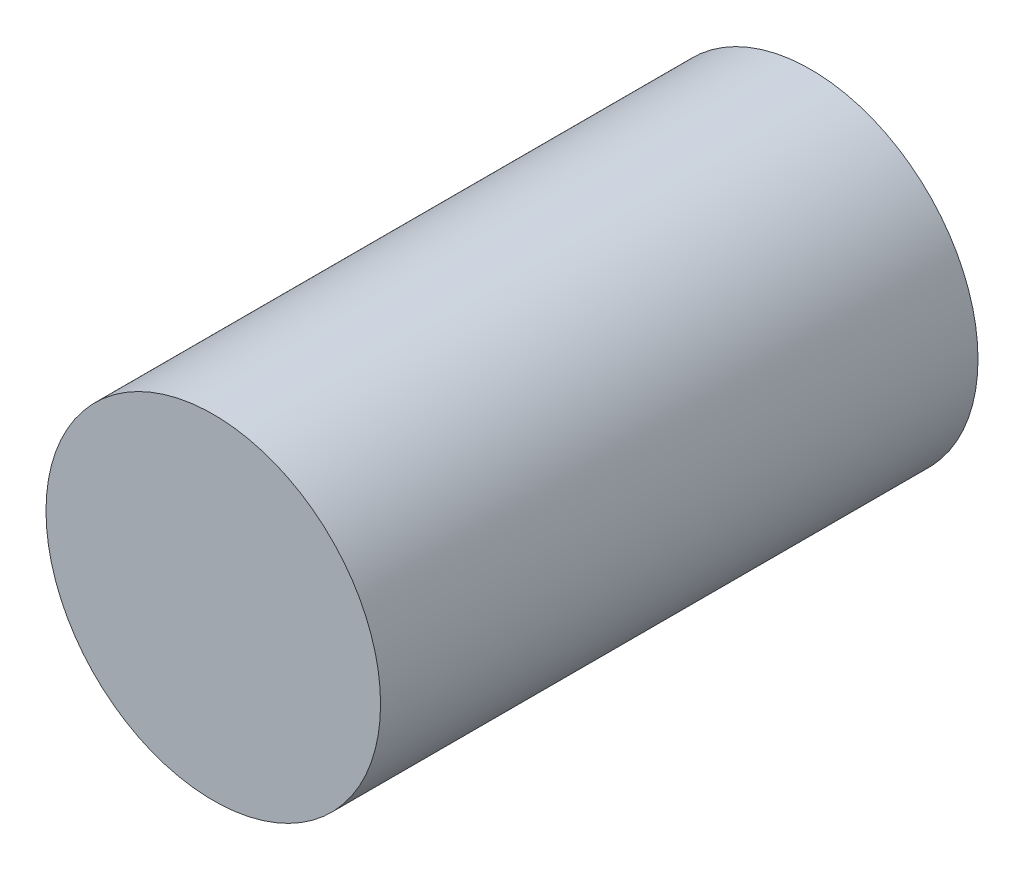
ISO-10303-21;
HEADER;
FILE_DESCRIPTION(('STEP AP214'),'2;1');
FILE_NAME('part.step','',(''),(''),'','','');
FILE_SCHEMA(('AUTOMOTIVE_DESIGN { 1 0 10303 214 1 1 1 1 }'));
ENDSEC;
DATA;
#1=APPLICATION_CONTEXT('core data for automotive mechanical design processes');
#2=APPLICATION_PROTOCOL_DEFINITION('international standard','automotive_design',2000,#1);
#3=PRODUCT_CONTEXT('',#1,'mechanical');
#4=PRODUCT('Part','Part','',(#3));
#5=PRODUCT_RELATED_PRODUCT_CATEGORY('part','',(#4));
#6=PRODUCT_DEFINITION_FORMATION('','',#4);
#7=PRODUCT_DEFINITION_CONTEXT('part definition',#1,'design');
#8=PRODUCT_DEFINITION('design','',#6,#7);
#9=PRODUCT_DEFINITION_SHAPE('','',#8);
#10=(LENGTH_UNIT() NAMED_UNIT(*) SI_UNIT(.MILLI.,.METRE.));
#11=(NAMED_UNIT(*) PLANE_ANGLE_UNIT() SI_UNIT($,.RADIAN.));
#12=(NAMED_UNIT(*) SI_UNIT($,.STERADIAN.) SOLID_ANGLE_UNIT());
#13=UNCERTAINTY_MEASURE_WITH_UNIT(LENGTH_MEASURE(1.E-05),#10,'distance_accuracy_value','');
#14=(GEOMETRIC_REPRESENTATION_CONTEXT(3) GLOBAL_UNCERTAINTY_ASSIGNED_CONTEXT((#13)) GLOBAL_UNIT_ASSIGNED_CONTEXT((#10,
#11,#12)) REPRESENTATION_CONTEXT('',''));
#15=CARTESIAN_POINT('',(0.,0.,0.));
#16=DIRECTION('',(0.,0.,1.));
#17=DIRECTION('',(1.,0.,0.));
#18=AXIS2_PLACEMENT_3D('',#15,#16,#17);
#19=CARTESIAN_POINT('',(0.,0.,35.));
#20=DIRECTION('',(0.,0.,-1.));
#21=DIRECTION('',(-1.,0.,0.));
#22=AXIS2_PLACEMENT_3D('',#19,#20,#21);
#23=CYLINDRICAL_SURFACE('',#22,7.);
#24=CARTESIAN_POINT('',(0.,0.,0.));
#25=DIRECTION('',(0.,0.,1.));
#26=DIRECTION('',(1.,0.,0.));
#27=AXIS2_PLACEMENT_3D('',#24,#25,#26);
#28=CIRCLE('',#27,7.);
#29=CARTESIAN_POINT('',(7.,0.,0.));
#30=VERTEX_POINT('',#29);
#31=EDGE_CURVE('E10',#30,#30,#28,.T.);
#32=ORIENTED_EDGE('',*,*,#31,.T.);
#33=EDGE_LOOP('',(#32));
#34=FACE_BOUND('',#33,.T.);
#35=CARTESIAN_POINT('',(0.,0.,25.));
#36=DIRECTION('',(0.,0.,1.));
#37=DIRECTION('',(1.,0.,0.));
#38=AXIS2_PLACEMENT_3D('',#35,#36,#37);
#39=CIRCLE('',#38,7.);
#40=CARTESIAN_POINT('',(7.,0.,25.));
#41=VERTEX_POINT('',#40);
#42=EDGE_CURVE('E34',#41,#41,#39,.T.);
#43=ORIENTED_EDGE('',*,*,#42,.F.);
#44=EDGE_LOOP('',(#43));
#45=FACE_BOUND('',#44,.T.);
#46=ADVANCED_FACE('F31',(#34,#45),#23,.T.);
#47=CARTESIAN_POINT('',(0.,0.,0.));
#48=DIRECTION('',(0.,0.,1.));
#49=DIRECTION('',(1.,0.,0.));
#50=AXIS2_PLACEMENT_3D('',#47,#48,#49);
#51=PLANE('',#50);
#52=ORIENTED_EDGE('',*,*,#31,.F.);
#53=EDGE_LOOP('',(#52));
#54=FACE_BOUND('',#53,.T.);
#55=ADVANCED_FACE('F46',(#54),#51,.F.);
#56=CARTESIAN_POINT('',(0.,0.,25.));
#57=DIRECTION('',(0.,0.,1.));
#58=DIRECTION('',(1.,0.,0.));
#59=AXIS2_PLACEMENT_3D('',#56,#57,#58);
#60=PLANE('',#59);
#61=ORIENTED_EDGE('',*,*,#42,.T.);
#62=EDGE_LOOP('',(#61));
#63=FACE_BOUND('',#62,.T.);
#64=ADVANCED_FACE('F43',(#63),#60,.T.);
#65=CLOSED_SHELL('',(#46,#55,#64));
#66=MANIFOLD_SOLID_BREP('B2',#65);
#67=ADVANCED_BREP_SHAPE_REPRESENTATION('',(#18,#66),#14);
#68=SHAPE_DEFINITION_REPRESENTATION(#9,#67);
ENDSEC;
END-ISO-10303-21;
